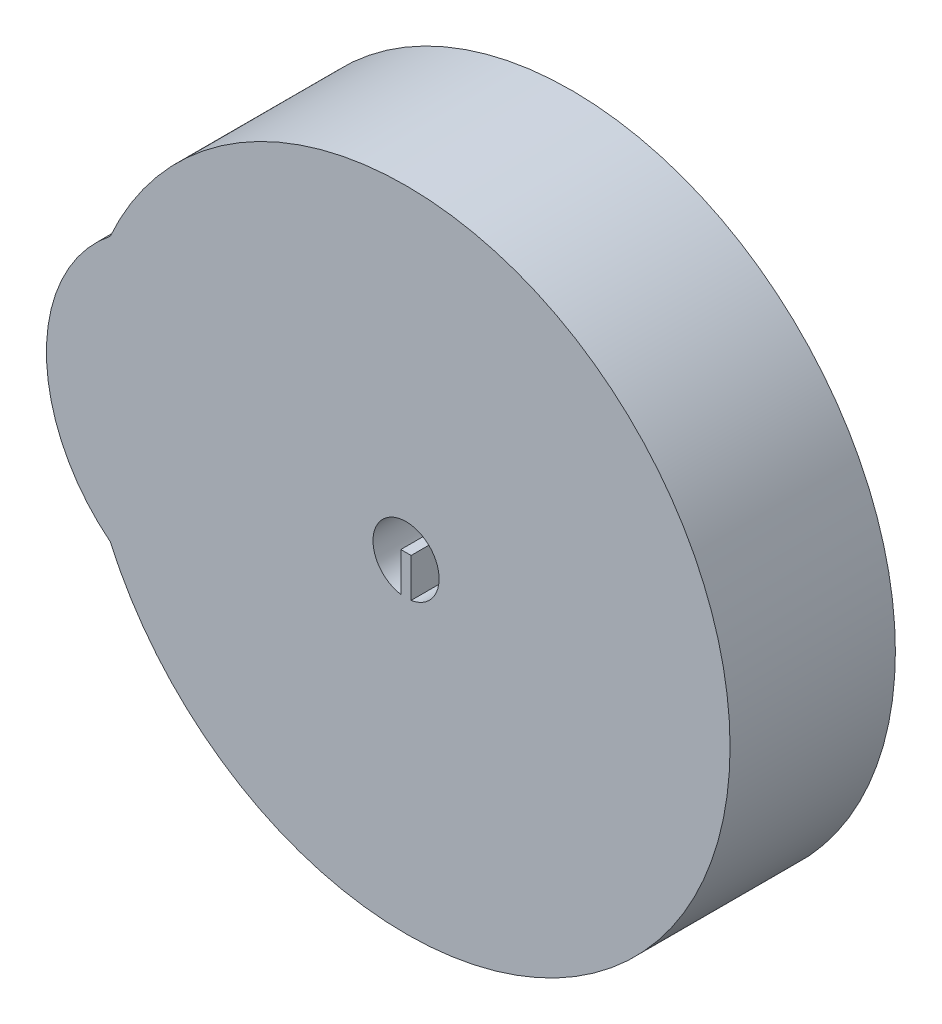
ISO-10303-21;
HEADER;
FILE_DESCRIPTION(('STEP AP214'),'2;1');
FILE_NAME('part.step','',(''),(''),'','','');
FILE_SCHEMA(('AUTOMOTIVE_DESIGN { 1 0 10303 214 1 1 1 1 }'));
ENDSEC;
DATA;
#1=APPLICATION_CONTEXT('core data for automotive mechanical design processes');
#2=APPLICATION_PROTOCOL_DEFINITION('international standard','automotive_design',2000,#1);
#3=PRODUCT_CONTEXT('',#1,'mechanical');
#4=PRODUCT('Part','Part','',(#3));
#5=PRODUCT_RELATED_PRODUCT_CATEGORY('part','',(#4));
#6=PRODUCT_DEFINITION_FORMATION('','',#4);
#7=PRODUCT_DEFINITION_CONTEXT('part definition',#1,'design');
#8=PRODUCT_DEFINITION('design','',#6,#7);
#9=PRODUCT_DEFINITION_SHAPE('','',#8);
#10=(LENGTH_UNIT() NAMED_UNIT(*) SI_UNIT(.MILLI.,.METRE.));
#11=(NAMED_UNIT(*) PLANE_ANGLE_UNIT() SI_UNIT($,.RADIAN.));
#12=(NAMED_UNIT(*) SI_UNIT($,.STERADIAN.) SOLID_ANGLE_UNIT());
#13=UNCERTAINTY_MEASURE_WITH_UNIT(LENGTH_MEASURE(1.E-05),#10,'distance_accuracy_value','');
#14=(GEOMETRIC_REPRESENTATION_CONTEXT(3) GLOBAL_UNCERTAINTY_ASSIGNED_CONTEXT((#13)) GLOBAL_UNIT_ASSIGNED_CONTEXT((#10,
#11,#12)) REPRESENTATION_CONTEXT('',''));
#15=CARTESIAN_POINT('',(0.,0.,0.));
#16=DIRECTION('',(0.,0.,1.));
#17=DIRECTION('',(1.,0.,0.));
#18=AXIS2_PLACEMENT_3D('',#15,#16,#17);
#19=CARTESIAN_POINT('',(0.,0.,25.));
#20=DIRECTION('',(0.,0.,-1.));
#21=DIRECTION('',(-1.,0.,0.));
#22=AXIS2_PLACEMENT_3D('',#19,#20,#21);
#23=CYLINDRICAL_SURFACE('',#22,49.);
#24=CARTESIAN_POINT('',(0.,0.,0.));
#25=DIRECTION('',(0.,0.,1.));
#26=DIRECTION('',(1.,0.,0.));
#27=AXIS2_PLACEMENT_3D('',#24,#25,#26);
#28=CIRCLE('',#27,49.);
#29=CARTESIAN_POINT('',(-44.7325384926901,-20.,0.));
#30=VERTEX_POINT('',#29);
#31=CARTESIAN_POINT('',(-44.7325384926901,20.,0.));
#32=VERTEX_POINT('',#31);
#33=EDGE_CURVE('E84',#30,#32,#28,.T.);
#34=ORIENTED_EDGE('',*,*,#33,.T.);
#35=DIRECTION('',(0.,0.,-1.));
#36=VECTOR('',#35,1.);
#37=CARTESIAN_POINT('',(-44.7325384926901,20.,25.));
#38=LINE('',#37,#36);
#39=CARTESIAN_POINT('',(-44.7325384926901,20.,25.));
#40=VERTEX_POINT('',#39);
#41=EDGE_CURVE('E54',#40,#32,#38,.T.);
#42=ORIENTED_EDGE('',*,*,#41,.F.);
#43=CARTESIAN_POINT('',(0.,0.,25.));
#44=DIRECTION('',(0.,0.,1.));
#45=DIRECTION('',(1.,0.,0.));
#46=AXIS2_PLACEMENT_3D('',#43,#44,#45);
#47=CIRCLE('',#46,49.);
#48=CARTESIAN_POINT('',(-44.7325384926901,-20.,25.));
#49=VERTEX_POINT('',#48);
#50=EDGE_CURVE('E49',#49,#40,#47,.T.);
#51=ORIENTED_EDGE('',*,*,#50,.F.);
#52=DIRECTION('',(0.,0.,-1.));
#53=VECTOR('',#52,1.);
#54=CARTESIAN_POINT('',(-44.7325384926901,-20.,25.));
#55=LINE('',#54,#53);
#56=EDGE_CURVE('E90',#49,#30,#55,.T.);
#57=ORIENTED_EDGE('',*,*,#56,.T.);
#58=EDGE_LOOP('',(#34,#42,#51,#57));
#59=FACE_BOUND('',#58,.T.);
#60=ADVANCED_FACE('F35',(#59),#23,.T.);
#61=CARTESIAN_POINT('',(0.,0.,25.));
#62=DIRECTION('',(0.,0.,1.));
#63=DIRECTION('',(1.,0.,0.));
#64=AXIS2_PLACEMENT_3D('',#61,#62,#63);
#65=PLANE('',#64);
#66=CARTESIAN_POINT('',(0.,0.,25.));
#67=DIRECTION('',(0.,0.,-1.));
#68=DIRECTION('',(-1.,0.,0.));
#69=AXIS2_PLACEMENT_3D('',#66,#67,#68);
#70=CIRCLE('',#69,5.);
#71=CARTESIAN_POINT('',(-0.788195887168577,-4.93748389804469,25.));
#72=VERTEX_POINT('',#71);
#73=CARTESIAN_POINT('',(0.767600049598759,-4.94072769578085,25.));
#74=VERTEX_POINT('',#73);
#75=EDGE_CURVE('E88',#72,#74,#70,.T.);
#76=ORIENTED_EDGE('',*,*,#75,.T.);
#77=DIRECTION('',(0.,-1.,0.));
#78=VECTOR('',#77,1.);
#79=CARTESIAN_POINT('',(0.767600049598759,0.94904927512716,25.));
#80=LINE('',#79,#78);
#81=CARTESIAN_POINT('',(0.767600049598759,0.94904927512716,25.));
#82=VERTEX_POINT('',#81);
#83=EDGE_CURVE('E102',#82,#74,#80,.T.);
#84=ORIENTED_EDGE('',*,*,#83,.F.);
#85=DIRECTION('',(1.,0.,0.));
#86=VECTOR('',#85,1.);
#87=CARTESIAN_POINT('',(0.767600049598759,0.94904927512716,25.));
#88=LINE('',#87,#86);
#89=CARTESIAN_POINT('',(-0.788195887168577,0.94904927512716,25.));
#90=VERTEX_POINT('',#89);
#91=EDGE_CURVE('E108',#90,#82,#88,.T.);
#92=ORIENTED_EDGE('',*,*,#91,.F.);
#93=DIRECTION('',(0.,1.,0.));
#94=VECTOR('',#93,1.);
#95=CARTESIAN_POINT('',(-0.788195887168577,0.94904927512716,25.));
#96=LINE('',#95,#94);
#97=EDGE_CURVE('E105',#72,#90,#96,.T.);
#98=ORIENTED_EDGE('',*,*,#97,.F.);
#99=EDGE_LOOP('',(#76,#84,#92,#98));
#100=FACE_BOUND('',#99,.T.);
#101=ORIENTED_EDGE('',*,*,#50,.T.);
#102=CARTESIAN_POINT('',(-28.8387699681551,0.,25.));
#103=DIRECTION('',(0.,0.,-1.));
#104=DIRECTION('',(1.,0.,0.));
#105=AXIS2_PLACEMENT_3D('',#102,#103,#104);
#106=CIRCLE('',#105,25.5462693540857);
#107=EDGE_CURVE('E94',#49,#40,#106,.T.);
#108=ORIENTED_EDGE('',*,*,#107,.F.);
#109=EDGE_LOOP('',(#101,#108));
#110=FACE_BOUND('',#109,.T.);
#111=ADVANCED_FACE('F143',(#100,#110),#65,.T.);
#112=CARTESIAN_POINT('',(0.,0.,0.));
#113=DIRECTION('',(0.,0.,1.));
#114=DIRECTION('',(1.,0.,0.));
#115=AXIS2_PLACEMENT_3D('',#112,#113,#114);
#116=PLANE('',#115);
#117=DIRECTION('',(0.,-1.,0.));
#118=VECTOR('',#117,1.);
#119=CARTESIAN_POINT('',(0.767600049598759,0.94904927512716,0.));
#120=LINE('',#119,#118);
#121=CARTESIAN_POINT('',(0.767600049598759,0.94904927512716,0.));
#122=VERTEX_POINT('',#121);
#123=CARTESIAN_POINT('',(0.767600049598759,-4.94072769578085,0.));
#124=VERTEX_POINT('',#123);
#125=EDGE_CURVE('E100',#122,#124,#120,.T.);
#126=ORIENTED_EDGE('',*,*,#125,.T.);
#127=CARTESIAN_POINT('',(0.,0.,0.));
#128=DIRECTION('',(0.,0.,-1.));
#129=DIRECTION('',(-1.,0.,0.));
#130=AXIS2_PLACEMENT_3D('',#127,#128,#129);
#131=CIRCLE('',#130,5.);
#132=CARTESIAN_POINT('',(-0.788195887168577,-4.93748389804469,0.));
#133=VERTEX_POINT('',#132);
#134=EDGE_CURVE('E120',#133,#124,#131,.T.);
#135=ORIENTED_EDGE('',*,*,#134,.F.);
#136=DIRECTION('',(0.,1.,0.));
#137=VECTOR('',#136,1.);
#138=CARTESIAN_POINT('',(-0.788195887168577,0.94904927512716,0.));
#139=LINE('',#138,#137);
#140=CARTESIAN_POINT('',(-0.788195887168577,0.94904927512716,0.));
#141=VERTEX_POINT('',#140);
#142=EDGE_CURVE('E114',#133,#141,#139,.T.);
#143=ORIENTED_EDGE('',*,*,#142,.T.);
#144=DIRECTION('',(1.,0.,0.));
#145=VECTOR('',#144,1.);
#146=CARTESIAN_POINT('',(0.767600049598759,0.94904927512716,0.));
#147=LINE('',#146,#145);
#148=EDGE_CURVE('E106',#141,#122,#147,.T.);
#149=ORIENTED_EDGE('',*,*,#148,.T.);
#150=EDGE_LOOP('',(#126,#135,#143,#149));
#151=FACE_BOUND('',#150,.T.);
#152=ORIENTED_EDGE('',*,*,#33,.F.);
#153=CARTESIAN_POINT('',(-28.8387699681551,0.,0.));
#154=DIRECTION('',(0.,0.,-1.));
#155=DIRECTION('',(1.,0.,0.));
#156=AXIS2_PLACEMENT_3D('',#153,#154,#155);
#157=CIRCLE('',#156,25.5462693540857);
#158=EDGE_CURVE('E87',#30,#32,#157,.T.);
#159=ORIENTED_EDGE('',*,*,#158,.T.);
#160=EDGE_LOOP('',(#152,#159));
#161=FACE_BOUND('',#160,.T.);
#162=ADVANCED_FACE('F85',(#151,#161),#116,.F.);
#163=CARTESIAN_POINT('',(0.,0.,25.));
#164=DIRECTION('',(0.,0.,-1.));
#165=DIRECTION('',(-1.,0.,0.));
#166=AXIS2_PLACEMENT_3D('',#163,#164,#165);
#167=CYLINDRICAL_SURFACE('',#166,5.);
#168=ORIENTED_EDGE('',*,*,#134,.T.);
#169=DIRECTION('',(0.,0.,-1.));
#170=VECTOR('',#169,1.);
#171=CARTESIAN_POINT('',(0.767600049598759,-4.94072769578085,25.));
#172=LINE('',#171,#170);
#173=EDGE_CURVE('E11',#124,#74,#172,.F.);
#174=ORIENTED_EDGE('',*,*,#173,.T.);
#175=ORIENTED_EDGE('',*,*,#75,.F.);
#176=DIRECTION('',(0.,0.,-1.));
#177=VECTOR('',#176,1.);
#178=CARTESIAN_POINT('',(-0.788195887168577,-4.93748389804469,25.));
#179=LINE('',#178,#177);
#180=EDGE_CURVE('E42',#72,#133,#179,.T.);
#181=ORIENTED_EDGE('',*,*,#180,.T.);
#182=EDGE_LOOP('',(#168,#174,#175,#181));
#183=FACE_BOUND('',#182,.T.);
#184=ADVANCED_FACE('F130',(#183),#167,.F.);
#185=CARTESIAN_POINT('',(0.767600049598759,0.94904927512716,25.));
#186=DIRECTION('',(1.,0.,0.));
#187=DIRECTION('',(0.,0.,-1.));
#188=AXIS2_PLACEMENT_3D('',#185,#186,#187);
#189=PLANE('',#188);
#190=ORIENTED_EDGE('',*,*,#173,.F.);
#191=ORIENTED_EDGE('',*,*,#125,.F.);
#192=DIRECTION('',(0.,0.,-1.));
#193=VECTOR('',#192,1.);
#194=CARTESIAN_POINT('',(0.767600049598759,0.94904927512716,25.));
#195=LINE('',#194,#193);
#196=EDGE_CURVE('E118',#82,#122,#195,.T.);
#197=ORIENTED_EDGE('',*,*,#196,.F.);
#198=ORIENTED_EDGE('',*,*,#83,.T.);
#199=EDGE_LOOP('',(#190,#191,#197,#198));
#200=FACE_BOUND('',#199,.T.);
#201=ADVANCED_FACE('F140',(#200),#189,.T.);
#202=CARTESIAN_POINT('',(-0.788195887168577,0.94904927512716,25.));
#203=DIRECTION('',(-1.,0.,0.));
#204=DIRECTION('',(0.,0.,1.));
#205=AXIS2_PLACEMENT_3D('',#202,#203,#204);
#206=PLANE('',#205);
#207=ORIENTED_EDGE('',*,*,#180,.F.);
#208=ORIENTED_EDGE('',*,*,#97,.T.);
#209=DIRECTION('',(0.,0.,-1.));
#210=VECTOR('',#209,1.);
#211=CARTESIAN_POINT('',(-0.788195887168577,0.94904927512716,25.));
#212=LINE('',#211,#210);
#213=EDGE_CURVE('E111',#90,#141,#212,.T.);
#214=ORIENTED_EDGE('',*,*,#213,.T.);
#215=ORIENTED_EDGE('',*,*,#142,.F.);
#216=EDGE_LOOP('',(#207,#208,#214,#215));
#217=FACE_BOUND('',#216,.T.);
#218=ADVANCED_FACE('F134',(#217),#206,.T.);
#219=CARTESIAN_POINT('',(0.767600049598759,0.94904927512716,25.));
#220=DIRECTION('',(0.,1.,0.));
#221=DIRECTION('',(0.,0.,1.));
#222=AXIS2_PLACEMENT_3D('',#219,#220,#221);
#223=PLANE('',#222);
#224=ORIENTED_EDGE('',*,*,#148,.F.);
#225=ORIENTED_EDGE('',*,*,#213,.F.);
#226=ORIENTED_EDGE('',*,*,#91,.T.);
#227=ORIENTED_EDGE('',*,*,#196,.T.);
#228=EDGE_LOOP('',(#224,#225,#226,#227));
#229=FACE_BOUND('',#228,.T.);
#230=ADVANCED_FACE('F147',(#229),#223,.T.);
#231=CARTESIAN_POINT('',(-28.8387699681551,0.,25.));
#232=DIRECTION('',(0.,0.,-1.));
#233=DIRECTION('',(-1.,0.,0.));
#234=AXIS2_PLACEMENT_3D('',#231,#232,#233);
#235=CYLINDRICAL_SURFACE('',#234,25.5462693540857);
#236=ORIENTED_EDGE('',*,*,#158,.F.);
#237=ORIENTED_EDGE('',*,*,#56,.F.);
#238=ORIENTED_EDGE('',*,*,#107,.T.);
#239=ORIENTED_EDGE('',*,*,#41,.T.);
#240=EDGE_LOOP('',(#236,#237,#238,#239));
#241=FACE_BOUND('',#240,.T.);
#242=ADVANCED_FACE('F96',(#241),#235,.T.);
#243=CLOSED_SHELL('',(#60,#111,#162,#184,#201,#218,#230,#242));
#244=MANIFOLD_SOLID_BREP('B2',#243);
#245=ADVANCED_BREP_SHAPE_REPRESENTATION('',(#18,#244),#14);
#246=SHAPE_DEFINITION_REPRESENTATION(#9,#245);
ENDSEC;
END-ISO-10303-21;
